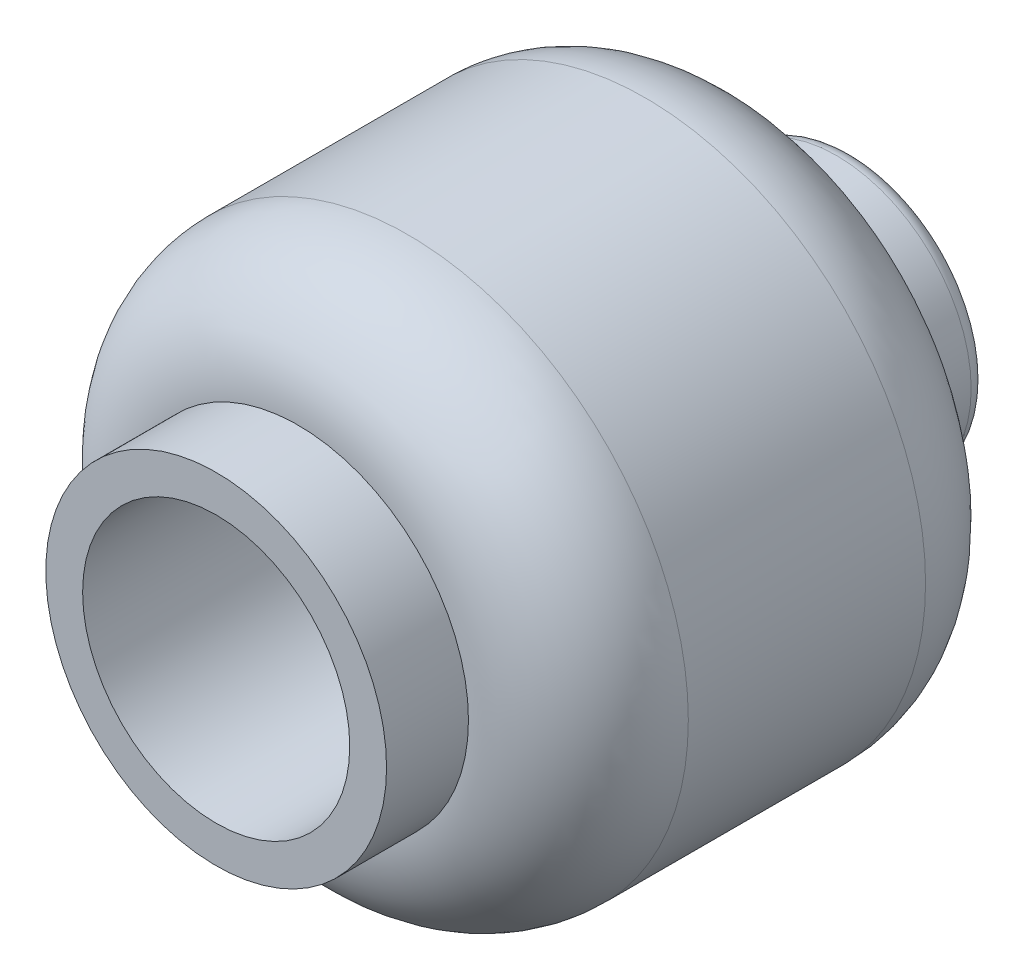
ISO-10303-21;
HEADER;
FILE_DESCRIPTION(('STEP AP214'),'2;1');
FILE_NAME('part.step','',(''),(''),'','','');
FILE_SCHEMA(('AUTOMOTIVE_DESIGN { 1 0 10303 214 1 1 1 1 }'));
ENDSEC;
DATA;
#1=APPLICATION_CONTEXT('core data for automotive mechanical design processes');
#2=APPLICATION_PROTOCOL_DEFINITION('international standard','automotive_design',2000,#1);
#3=PRODUCT_CONTEXT('',#1,'mechanical');
#4=PRODUCT('Part','Part','',(#3));
#5=PRODUCT_RELATED_PRODUCT_CATEGORY('part','',(#4));
#6=PRODUCT_DEFINITION_FORMATION('','',#4);
#7=PRODUCT_DEFINITION_CONTEXT('part definition',#1,'design');
#8=PRODUCT_DEFINITION('design','',#6,#7);
#9=PRODUCT_DEFINITION_SHAPE('','',#8);
#10=(LENGTH_UNIT() NAMED_UNIT(*) SI_UNIT(.MILLI.,.METRE.));
#11=(NAMED_UNIT(*) PLANE_ANGLE_UNIT() SI_UNIT($,.RADIAN.));
#12=(NAMED_UNIT(*) SI_UNIT($,.STERADIAN.) SOLID_ANGLE_UNIT());
#13=UNCERTAINTY_MEASURE_WITH_UNIT(LENGTH_MEASURE(1.E-05),#10,'distance_accuracy_value','');
#14=(GEOMETRIC_REPRESENTATION_CONTEXT(3) GLOBAL_UNCERTAINTY_ASSIGNED_CONTEXT((#13)) GLOBAL_UNIT_ASSIGNED_CONTEXT((#10,
#11,#12)) REPRESENTATION_CONTEXT('',''));
#15=CARTESIAN_POINT('',(0.,0.,0.));
#16=DIRECTION('',(0.,0.,1.));
#17=DIRECTION('',(1.,0.,0.));
#18=AXIS2_PLACEMENT_3D('',#15,#16,#17);
#19=CARTESIAN_POINT('',(0.,0.,-294.2844));
#20=DIRECTION('',(0.,0.,1.));
#21=DIRECTION('',(1.,0.,0.));
#22=AXIS2_PLACEMENT_3D('',#19,#20,#21);
#23=PLANE('',#22);
#24=CARTESIAN_POINT('',(0.,0.,-294.2844));
#25=DIRECTION('',(0.,0.,1.));
#26=DIRECTION('',(1.,0.,0.));
#27=AXIS2_PLACEMENT_3D('',#24,#25,#26);
#28=CIRCLE('',#27,54.61);
#29=CARTESIAN_POINT('',(54.61,0.,-294.2844));
#30=VERTEX_POINT('',#29);
#31=EDGE_CURVE('E10',#30,#30,#28,.F.);
#32=ORIENTED_EDGE('',*,*,#31,.T.);
#33=EDGE_LOOP('',(#32));
#34=FACE_BOUND('',#33,.T.);
#35=ADVANCED_FACE('F31',(#34),#23,.F.);
#36=CARTESIAN_POINT('',(0.,0.,0.));
#37=DIRECTION('',(0.,0.,1.));
#38=DIRECTION('',(1.,0.,0.));
#39=AXIS2_PLACEMENT_3D('',#36,#37,#38);
#40=CYLINDRICAL_SURFACE('',#39,62.23);
#41=CARTESIAN_POINT('',(0.,0.,-286.6644));
#42=DIRECTION('',(0.,0.,1.));
#43=DIRECTION('',(1.,0.,0.));
#44=AXIS2_PLACEMENT_3D('',#41,#42,#43);
#45=CIRCLE('',#44,62.23);
#46=CARTESIAN_POINT('',(62.23,0.,-286.6644));
#47=VERTEX_POINT('',#46);
#48=EDGE_CURVE('E38',#47,#47,#45,.T.);
#49=ORIENTED_EDGE('',*,*,#48,.T.);
#50=EDGE_LOOP('',(#49));
#51=FACE_BOUND('',#50,.T.);
#52=CARTESIAN_POINT('',(0.,0.,-249.0724));
#53=DIRECTION('',(0.,0.,1.));
#54=DIRECTION('',(1.,0.,0.));
#55=AXIS2_PLACEMENT_3D('',#52,#53,#54);
#56=CIRCLE('',#55,62.23);
#57=CARTESIAN_POINT('',(62.23,0.,-249.0724));
#58=VERTEX_POINT('',#57);
#59=EDGE_CURVE('E54',#58,#58,#56,.T.);
#60=ORIENTED_EDGE('',*,*,#59,.F.);
#61=EDGE_LOOP('',(#60));
#62=FACE_BOUND('',#61,.T.);
#63=ADVANCED_FACE('F105',(#51,#62),#40,.T.);
#64=CARTESIAN_POINT('',(-62.23,0.,-249.0724));
#65=DIRECTION('',(0.,0.,1.));
#66=DIRECTION('',(1.,0.,0.));
#67=AXIS2_PLACEMENT_3D('',#64,#65,#66);
#68=PLANE('',#67);
#69=CARTESIAN_POINT('',(0.,0.,-249.0724));
#70=DIRECTION('',(0.,0.,1.));
#71=DIRECTION('',(1.,0.,0.));
#72=AXIS2_PLACEMENT_3D('',#69,#70,#71);
#73=CIRCLE('',#72,78.74);
#74=CARTESIAN_POINT('',(78.74,0.,-249.0724));
#75=VERTEX_POINT('',#74);
#76=EDGE_CURVE('E42',#75,#75,#73,.F.);
#77=ORIENTED_EDGE('',*,*,#76,.T.);
#78=EDGE_LOOP('',(#77));
#79=FACE_BOUND('',#78,.T.);
#80=ORIENTED_EDGE('',*,*,#59,.T.);
#81=EDGE_LOOP('',(#80));
#82=FACE_BOUND('',#81,.T.);
#83=ADVANCED_FACE('F109',(#79,#82),#68,.F.);
#84=CARTESIAN_POINT('',(0.,0.,0.));
#85=DIRECTION('',(0.,0.,1.));
#86=DIRECTION('',(1.,0.,0.));
#87=AXIS2_PLACEMENT_3D('',#84,#85,#86);
#88=CYLINDRICAL_SURFACE('',#87,129.54);
#89=CARTESIAN_POINT('',(0.,0.,-88.646));
#90=DIRECTION('',(0.,0.,-1.));
#91=DIRECTION('',(-1.,0.,0.));
#92=AXIS2_PLACEMENT_3D('',#89,#90,#91);
#93=CIRCLE('',#92,129.54);
#94=CARTESIAN_POINT('',(-129.54,0.,-88.646));
#95=VERTEX_POINT('',#94);
#96=EDGE_CURVE('E46',#95,#95,#93,.T.);
#97=ORIENTED_EDGE('',*,*,#96,.T.);
#98=EDGE_LOOP('',(#97));
#99=FACE_BOUND('',#98,.T.);
#100=CARTESIAN_POINT('',(0.,0.,-198.2724));
#101=DIRECTION('',(0.,0.,1.));
#102=DIRECTION('',(1.,0.,0.));
#103=AXIS2_PLACEMENT_3D('',#100,#101,#102);
#104=CIRCLE('',#103,129.54);
#105=CARTESIAN_POINT('',(129.54,0.,-198.2724));
#106=VERTEX_POINT('',#105);
#107=EDGE_CURVE('E51',#106,#106,#104,.T.);
#108=ORIENTED_EDGE('',*,*,#107,.T.);
#109=EDGE_LOOP('',(#108));
#110=FACE_BOUND('',#109,.T.);
#111=ADVANCED_FACE('F87',(#99,#110),#88,.T.);
#112=CARTESIAN_POINT('',(0.,0.,0.));
#113=DIRECTION('',(0.,0.,1.));
#114=DIRECTION('',(1.,0.,0.));
#115=AXIS2_PLACEMENT_3D('',#112,#113,#114);
#116=CYLINDRICAL_SURFACE('',#115,78.74);
#117=CARTESIAN_POINT('',(0.,0.,0.));
#118=DIRECTION('',(0.,0.,1.));
#119=DIRECTION('',(1.,0.,0.));
#120=AXIS2_PLACEMENT_3D('',#117,#118,#119);
#121=CIRCLE('',#120,78.74);
#122=CARTESIAN_POINT('',(78.74,0.,0.));
#123=VERTEX_POINT('',#122);
#124=EDGE_CURVE('E60',#123,#123,#121,.T.);
#125=ORIENTED_EDGE('',*,*,#124,.F.);
#126=EDGE_LOOP('',(#125));
#127=FACE_BOUND('',#126,.T.);
#128=CARTESIAN_POINT('',(0.,0.,-37.846));
#129=DIRECTION('',(0.,0.,1.));
#130=DIRECTION('',(1.,0.,0.));
#131=AXIS2_PLACEMENT_3D('',#128,#129,#130);
#132=CIRCLE('',#131,78.74);
#133=CARTESIAN_POINT('',(78.74,0.,-37.846));
#134=VERTEX_POINT('',#133);
#135=EDGE_CURVE('E57',#134,#134,#132,.T.);
#136=ORIENTED_EDGE('',*,*,#135,.T.);
#137=EDGE_LOOP('',(#136));
#138=FACE_BOUND('',#137,.T.);
#139=ADVANCED_FACE('F81',(#127,#138),#116,.T.);
#140=CARTESIAN_POINT('',(-78.74,0.,0.));
#141=DIRECTION('',(0.,0.,-1.));
#142=DIRECTION('',(-1.,0.,0.));
#143=AXIS2_PLACEMENT_3D('',#140,#141,#142);
#144=PLANE('',#143);
#145=CARTESIAN_POINT('',(0.,0.,0.));
#146=DIRECTION('',(0.,0.,1.));
#147=DIRECTION('',(1.,0.,0.));
#148=AXIS2_PLACEMENT_3D('',#145,#146,#147);
#149=CIRCLE('',#148,61.722);
#150=CARTESIAN_POINT('',(61.722,0.,0.));
#151=VERTEX_POINT('',#150);
#152=EDGE_CURVE('E63',#151,#151,#149,.T.);
#153=ORIENTED_EDGE('',*,*,#152,.F.);
#154=EDGE_LOOP('',(#153));
#155=FACE_BOUND('',#154,.T.);
#156=ORIENTED_EDGE('',*,*,#124,.T.);
#157=EDGE_LOOP('',(#156));
#158=FACE_BOUND('',#157,.T.);
#159=ADVANCED_FACE('F75',(#155,#158),#144,.F.);
#160=CARTESIAN_POINT('',(0.,0.,0.));
#161=DIRECTION('',(0.,0.,1.));
#162=DIRECTION('',(1.,0.,0.));
#163=AXIS2_PLACEMENT_3D('',#160,#161,#162);
#164=CYLINDRICAL_SURFACE('',#163,61.722);
#165=CARTESIAN_POINT('',(0.,0.,-147.1422));
#166=DIRECTION('',(0.,0.,1.));
#167=DIRECTION('',(1.,0.,0.));
#168=AXIS2_PLACEMENT_3D('',#165,#166,#167);
#169=CIRCLE('',#168,61.722);
#170=CARTESIAN_POINT('',(61.722,0.,-147.1422));
#171=VERTEX_POINT('',#170);
#172=EDGE_CURVE('E66',#171,#171,#169,.T.);
#173=ORIENTED_EDGE('',*,*,#172,.F.);
#174=EDGE_LOOP('',(#173));
#175=FACE_BOUND('',#174,.T.);
#176=ORIENTED_EDGE('',*,*,#152,.T.);
#177=EDGE_LOOP('',(#176));
#178=FACE_BOUND('',#177,.T.);
#179=ADVANCED_FACE('F72',(#175,#178),#164,.F.);
#180=CARTESIAN_POINT('',(-61.722,0.,-147.1422));
#181=DIRECTION('',(0.,0.,-1.));
#182=DIRECTION('',(-1.,0.,0.));
#183=AXIS2_PLACEMENT_3D('',#180,#181,#182);
#184=PLANE('',#183);
#185=ORIENTED_EDGE('',*,*,#172,.T.);
#186=EDGE_LOOP('',(#185));
#187=FACE_BOUND('',#186,.T.);
#188=ADVANCED_FACE('F70',(#187),#184,.F.);
#189=CARTESIAN_POINT('',(0.,0.,-88.646));
#190=DIRECTION('',(0.,0.,-1.));
#191=DIRECTION('',(-1.,0.,0.));
#192=AXIS2_PLACEMENT_3D('',#189,#190,#191);
#193=TOROIDAL_SURFACE('',#192,78.74,50.8);
#194=ORIENTED_EDGE('',*,*,#96,.F.);
#195=EDGE_LOOP('',(#194));
#196=FACE_BOUND('',#195,.T.);
#197=ORIENTED_EDGE('',*,*,#135,.F.);
#198=EDGE_LOOP('',(#197));
#199=FACE_BOUND('',#198,.T.);
#200=ADVANCED_FACE('F91',(#196,#199),#193,.T.);
#201=CARTESIAN_POINT('',(0.,0.,-198.2724));
#202=DIRECTION('',(0.,0.,1.));
#203=DIRECTION('',(1.,0.,0.));
#204=AXIS2_PLACEMENT_3D('',#201,#202,#203);
#205=TOROIDAL_SURFACE('',#204,78.74,50.8);
#206=ORIENTED_EDGE('',*,*,#76,.F.);
#207=EDGE_LOOP('',(#206));
#208=FACE_BOUND('',#207,.T.);
#209=ORIENTED_EDGE('',*,*,#107,.F.);
#210=EDGE_LOOP('',(#209));
#211=FACE_BOUND('',#210,.T.);
#212=ADVANCED_FACE('F93',(#208,#211),#205,.T.);
#213=CARTESIAN_POINT('',(0.,0.,-286.6644));
#214=DIRECTION('',(0.,0.,1.));
#215=DIRECTION('',(1.,0.,0.));
#216=AXIS2_PLACEMENT_3D('',#213,#214,#215);
#217=TOROIDAL_SURFACE('',#216,54.61,7.62);
#218=ORIENTED_EDGE('',*,*,#31,.F.);
#219=EDGE_LOOP('',(#218));
#220=FACE_BOUND('',#219,.T.);
#221=ORIENTED_EDGE('',*,*,#48,.F.);
#222=EDGE_LOOP('',(#221));
#223=FACE_BOUND('',#222,.T.);
#224=ADVANCED_FACE('F33',(#220,#223),#217,.T.);
#225=CLOSED_SHELL('',(#35,#63,#83,#111,#139,#159,#179,#188,#200,#212,#224));
#226=MANIFOLD_SOLID_BREP('B2',#225);
#227=ADVANCED_BREP_SHAPE_REPRESENTATION('',(#18,#226),#14);
#228=SHAPE_DEFINITION_REPRESENTATION(#9,#227);
ENDSEC;
END-ISO-10303-21;
